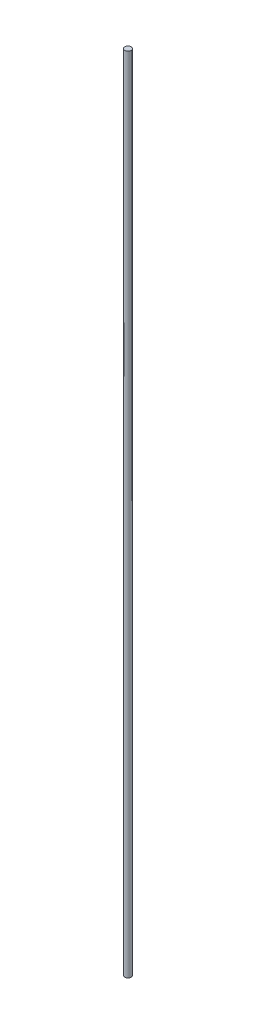
ISO-10303-21;
HEADER;
FILE_DESCRIPTION(('STEP AP214'),'2;1');
FILE_NAME('part.step','',(''),(''),'','','');
FILE_SCHEMA(('AUTOMOTIVE_DESIGN { 1 0 10303 214 1 1 1 1 }'));
ENDSEC;
DATA;
#1=APPLICATION_CONTEXT('core data for automotive mechanical design processes');
#2=APPLICATION_PROTOCOL_DEFINITION('international standard','automotive_design',2000,#1);
#3=PRODUCT_CONTEXT('',#1,'mechanical');
#4=PRODUCT('Part','Part','',(#3));
#5=PRODUCT_RELATED_PRODUCT_CATEGORY('part','',(#4));
#6=PRODUCT_DEFINITION_FORMATION('','',#4);
#7=PRODUCT_DEFINITION_CONTEXT('part definition',#1,'design');
#8=PRODUCT_DEFINITION('design','',#6,#7);
#9=PRODUCT_DEFINITION_SHAPE('','',#8);
#10=(LENGTH_UNIT() NAMED_UNIT(*) SI_UNIT(.MILLI.,.METRE.));
#11=(NAMED_UNIT(*) PLANE_ANGLE_UNIT() SI_UNIT($,.RADIAN.));
#12=(NAMED_UNIT(*) SI_UNIT($,.STERADIAN.) SOLID_ANGLE_UNIT());
#13=UNCERTAINTY_MEASURE_WITH_UNIT(LENGTH_MEASURE(1.E-05),#10,'distance_accuracy_value','');
#14=(GEOMETRIC_REPRESENTATION_CONTEXT(3) GLOBAL_UNCERTAINTY_ASSIGNED_CONTEXT((#13)) GLOBAL_UNIT_ASSIGNED_CONTEXT((#10,
#11,#12)) REPRESENTATION_CONTEXT('',''));
#15=CARTESIAN_POINT('',(0.,0.,0.));
#16=DIRECTION('',(0.,0.,1.));
#17=DIRECTION('',(1.,0.,0.));
#18=AXIS2_PLACEMENT_3D('',#15,#16,#17);
#19=CARTESIAN_POINT('',(0.,1010.,0.));
#20=DIRECTION('',(0.,-1.,0.));
#21=DIRECTION('',(0.,0.,-1.));
#22=AXIS2_PLACEMENT_3D('',#19,#20,#21);
#23=CYLINDRICAL_SURFACE('',#22,4.);
#24=CARTESIAN_POINT('',(0.,1010.,0.));
#25=DIRECTION('',(0.,1.,0.));
#26=DIRECTION('',(0.,0.,1.));
#27=AXIS2_PLACEMENT_3D('',#24,#25,#26);
#28=CIRCLE('',#27,4.);
#29=CARTESIAN_POINT('',(0.,1010.,4.));
#30=VERTEX_POINT('',#29);
#31=EDGE_CURVE('E10',#30,#30,#28,.T.);
#32=ORIENTED_EDGE('',*,*,#31,.F.);
#33=EDGE_LOOP('',(#32));
#34=FACE_BOUND('',#33,.T.);
#35=CARTESIAN_POINT('',(0.,0.,0.));
#36=DIRECTION('',(0.,1.,0.));
#37=DIRECTION('',(0.,0.,1.));
#38=AXIS2_PLACEMENT_3D('',#35,#36,#37);
#39=CIRCLE('',#38,4.);
#40=CARTESIAN_POINT('',(0.,0.,4.));
#41=VERTEX_POINT('',#40);
#42=EDGE_CURVE('E46',#41,#41,#39,.T.);
#43=ORIENTED_EDGE('',*,*,#42,.T.);
#44=EDGE_LOOP('',(#43));
#45=FACE_BOUND('',#44,.T.);
#46=ADVANCED_FACE('F43',(#34,#45),#23,.T.);
#47=CARTESIAN_POINT('',(0.,1010.,0.));
#48=DIRECTION('',(0.,1.,0.));
#49=DIRECTION('',(0.,0.,1.));
#50=AXIS2_PLACEMENT_3D('',#47,#48,#49);
#51=PLANE('',#50);
#52=ORIENTED_EDGE('',*,*,#31,.T.);
#53=EDGE_LOOP('',(#52));
#54=FACE_BOUND('',#53,.T.);
#55=ADVANCED_FACE('F60',(#54),#51,.T.);
#56=CARTESIAN_POINT('',(0.,0.,0.));
#57=DIRECTION('',(0.,1.,0.));
#58=DIRECTION('',(0.,0.,1.));
#59=AXIS2_PLACEMENT_3D('',#56,#57,#58);
#60=PLANE('',#59);
#61=ORIENTED_EDGE('',*,*,#42,.F.);
#62=EDGE_LOOP('',(#61));
#63=FACE_BOUND('',#62,.T.);
#64=ADVANCED_FACE('F58',(#63),#60,.F.);
#65=CLOSED_SHELL('',(#46,#55,#64));
#66=MANIFOLD_SOLID_BREP('B2',#65);
#67=ADVANCED_BREP_SHAPE_REPRESENTATION('',(#18,#66),#14);
#68=SHAPE_DEFINITION_REPRESENTATION(#9,#67);
ENDSEC;
END-ISO-10303-21;
